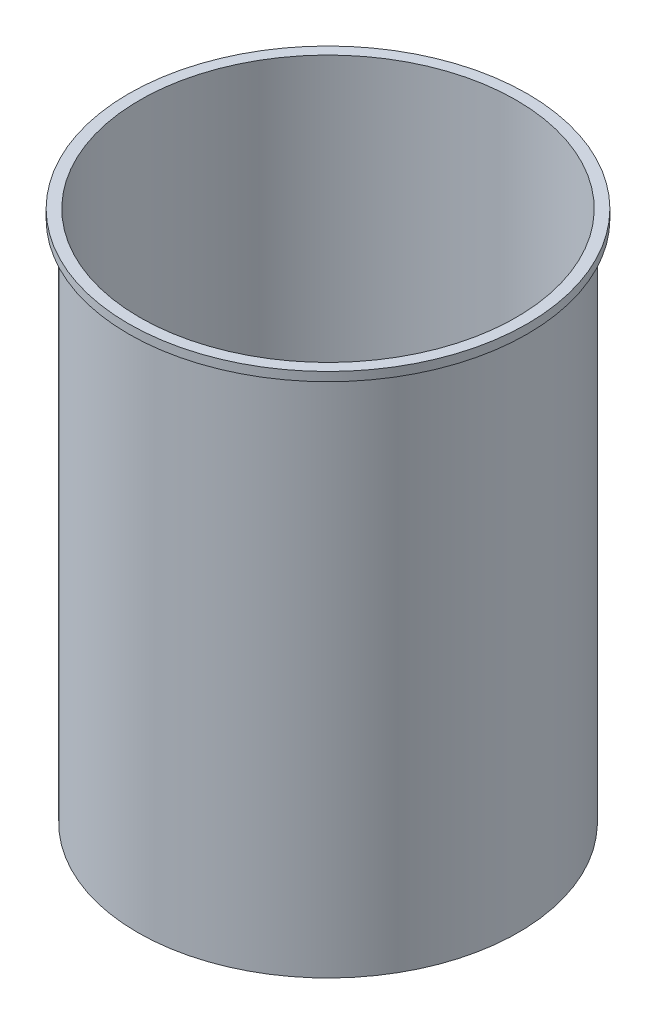
ISO-10303-21;
HEADER;
FILE_DESCRIPTION(('STEP AP214'),'2;1');
FILE_NAME('part.step','',(''),(''),'','','');
FILE_SCHEMA(('AUTOMOTIVE_DESIGN { 1 0 10303 214 1 1 1 1 }'));
ENDSEC;
DATA;
#1=APPLICATION_CONTEXT('core data for automotive mechanical design processes');
#2=APPLICATION_PROTOCOL_DEFINITION('international standard','automotive_design',2000,#1);
#3=PRODUCT_CONTEXT('',#1,'mechanical');
#4=PRODUCT('Part','Part','',(#3));
#5=PRODUCT_RELATED_PRODUCT_CATEGORY('part','',(#4));
#6=PRODUCT_DEFINITION_FORMATION('','',#4);
#7=PRODUCT_DEFINITION_CONTEXT('part definition',#1,'design');
#8=PRODUCT_DEFINITION('design','',#6,#7);
#9=PRODUCT_DEFINITION_SHAPE('','',#8);
#10=(LENGTH_UNIT() NAMED_UNIT(*) SI_UNIT(.MILLI.,.METRE.));
#11=(NAMED_UNIT(*) PLANE_ANGLE_UNIT() SI_UNIT($,.RADIAN.));
#12=(NAMED_UNIT(*) SI_UNIT($,.STERADIAN.) SOLID_ANGLE_UNIT());
#13=UNCERTAINTY_MEASURE_WITH_UNIT(LENGTH_MEASURE(1.E-05),#10,'distance_accuracy_value','');
#14=(GEOMETRIC_REPRESENTATION_CONTEXT(3) GLOBAL_UNCERTAINTY_ASSIGNED_CONTEXT((#13)) GLOBAL_UNIT_ASSIGNED_CONTEXT((#10,
#11,#12)) REPRESENTATION_CONTEXT('',''));
#15=CARTESIAN_POINT('',(0.,0.,0.));
#16=DIRECTION('',(0.,0.,1.));
#17=DIRECTION('',(1.,0.,0.));
#18=AXIS2_PLACEMENT_3D('',#15,#16,#17);
#19=CARTESIAN_POINT('',(0.,0.,0.));
#20=DIRECTION('',(0.,1.,0.));
#21=DIRECTION('',(0.,0.,1.));
#22=AXIS2_PLACEMENT_3D('',#19,#20,#21);
#23=PLANE('',#22);
#24=CARTESIAN_POINT('',(0.,0.,0.));
#25=DIRECTION('',(0.,1.,0.));
#26=DIRECTION('',(0.,0.,1.));
#27=AXIS2_PLACEMENT_3D('',#24,#25,#26);
#28=CIRCLE('',#27,43.);
#29=CARTESIAN_POINT('',(0.,0.,43.));
#30=VERTEX_POINT('',#29);
#31=EDGE_CURVE('E35',#30,#30,#28,.T.);
#32=ORIENTED_EDGE('',*,*,#31,.F.);
#33=EDGE_LOOP('',(#32));
#34=FACE_BOUND('',#33,.T.);
#35=CARTESIAN_POINT('',(0.,0.,0.));
#36=DIRECTION('',(0.,1.,0.));
#37=DIRECTION('',(0.,0.,1.));
#38=AXIS2_PLACEMENT_3D('',#35,#36,#37);
#39=CIRCLE('',#38,42.5);
#40=CARTESIAN_POINT('',(0.,0.,42.5));
#41=VERTEX_POINT('',#40);
#42=EDGE_CURVE('E42',#41,#41,#39,.T.);
#43=ORIENTED_EDGE('',*,*,#42,.T.);
#44=EDGE_LOOP('',(#43));
#45=FACE_BOUND('',#44,.T.);
#46=ADVANCED_FACE('F31',(#34,#45),#23,.F.);
#47=CARTESIAN_POINT('',(0.,118.,0.));
#48=DIRECTION('',(0.,-1.,0.));
#49=DIRECTION('',(0.,0.,-1.));
#50=AXIS2_PLACEMENT_3D('',#47,#48,#49);
#51=CYLINDRICAL_SURFACE('',#50,43.);
#52=CARTESIAN_POINT('',(0.,118.,0.));
#53=DIRECTION('',(0.,1.,0.));
#54=DIRECTION('',(0.,0.,1.));
#55=AXIS2_PLACEMENT_3D('',#52,#53,#54);
#56=CIRCLE('',#55,43.);
#57=CARTESIAN_POINT('',(0.,118.,43.));
#58=VERTEX_POINT('',#57);
#59=EDGE_CURVE('E10',#58,#58,#56,.T.);
#60=ORIENTED_EDGE('',*,*,#59,.F.);
#61=EDGE_LOOP('',(#60));
#62=FACE_BOUND('',#61,.T.);
#63=ORIENTED_EDGE('',*,*,#31,.T.);
#64=EDGE_LOOP('',(#63));
#65=FACE_BOUND('',#64,.T.);
#66=ADVANCED_FACE('F33',(#62,#65),#51,.T.);
#67=CARTESIAN_POINT('',(0.,118.,0.));
#68=DIRECTION('',(0.,-1.,0.));
#69=DIRECTION('',(0.,0.,-1.));
#70=AXIS2_PLACEMENT_3D('',#67,#68,#69);
#71=CYLINDRICAL_SURFACE('',#70,42.5);
#72=ORIENTED_EDGE('',*,*,#42,.F.);
#73=EDGE_LOOP('',(#72));
#74=FACE_BOUND('',#73,.T.);
#75=CARTESIAN_POINT('',(0.,120.,0.));
#76=DIRECTION('',(0.,1.,0.));
#77=DIRECTION('',(0.,0.,1.));
#78=AXIS2_PLACEMENT_3D('',#75,#76,#77);
#79=CIRCLE('',#78,42.5);
#80=CARTESIAN_POINT('',(0.,120.,42.5));
#81=VERTEX_POINT('',#80);
#82=EDGE_CURVE('E50',#81,#81,#79,.T.);
#83=ORIENTED_EDGE('',*,*,#82,.T.);
#84=EDGE_LOOP('',(#83));
#85=FACE_BOUND('',#84,.T.);
#86=ADVANCED_FACE('F56',(#74,#85),#71,.F.);
#87=CARTESIAN_POINT('',(0.,120.,0.));
#88=DIRECTION('',(0.,1.,0.));
#89=DIRECTION('',(0.,0.,1.));
#90=AXIS2_PLACEMENT_3D('',#87,#88,#89);
#91=PLANE('',#90);
#92=CARTESIAN_POINT('',(0.,120.,0.));
#93=DIRECTION('',(0.,1.,0.));
#94=DIRECTION('',(0.,0.,1.));
#95=AXIS2_PLACEMENT_3D('',#92,#93,#94);
#96=CIRCLE('',#95,45.);
#97=CARTESIAN_POINT('',(0.,120.,45.));
#98=VERTEX_POINT('',#97);
#99=EDGE_CURVE('E46',#98,#98,#96,.T.);
#100=ORIENTED_EDGE('',*,*,#99,.T.);
#101=EDGE_LOOP('',(#100));
#102=FACE_BOUND('',#101,.T.);
#103=ORIENTED_EDGE('',*,*,#82,.F.);
#104=EDGE_LOOP('',(#103));
#105=FACE_BOUND('',#104,.T.);
#106=ADVANCED_FACE('F58',(#102,#105),#91,.T.);
#107=CARTESIAN_POINT('',(0.,118.,0.));
#108=DIRECTION('',(0.,1.,0.));
#109=DIRECTION('',(0.,0.,1.));
#110=AXIS2_PLACEMENT_3D('',#107,#108,#109);
#111=PLANE('',#110);
#112=ORIENTED_EDGE('',*,*,#59,.T.);
#113=EDGE_LOOP('',(#112));
#114=FACE_BOUND('',#113,.T.);
#115=CARTESIAN_POINT('',(0.,118.,0.));
#116=DIRECTION('',(0.,1.,0.));
#117=DIRECTION('',(0.,0.,1.));
#118=AXIS2_PLACEMENT_3D('',#115,#116,#117);
#119=CIRCLE('',#118,45.);
#120=CARTESIAN_POINT('',(0.,118.,45.));
#121=VERTEX_POINT('',#120);
#122=EDGE_CURVE('E47',#121,#121,#119,.T.);
#123=ORIENTED_EDGE('',*,*,#122,.F.);
#124=EDGE_LOOP('',(#123));
#125=FACE_BOUND('',#124,.T.);
#126=ADVANCED_FACE('F60',(#114,#125),#111,.F.);
#127=CARTESIAN_POINT('',(0.,120.,0.));
#128=DIRECTION('',(0.,-1.,0.));
#129=DIRECTION('',(0.,0.,-1.));
#130=AXIS2_PLACEMENT_3D('',#127,#128,#129);
#131=CYLINDRICAL_SURFACE('',#130,45.);
#132=ORIENTED_EDGE('',*,*,#99,.F.);
#133=EDGE_LOOP('',(#132));
#134=FACE_BOUND('',#133,.T.);
#135=ORIENTED_EDGE('',*,*,#122,.T.);
#136=EDGE_LOOP('',(#135));
#137=FACE_BOUND('',#136,.T.);
#138=ADVANCED_FACE('F67',(#134,#137),#131,.T.);
#139=CLOSED_SHELL('',(#46,#66,#86,#106,#126,#138));
#140=MANIFOLD_SOLID_BREP('B2',#139);
#141=ADVANCED_BREP_SHAPE_REPRESENTATION('',(#18,#140),#14);
#142=SHAPE_DEFINITION_REPRESENTATION(#9,#141);
ENDSEC;
END-ISO-10303-21;
